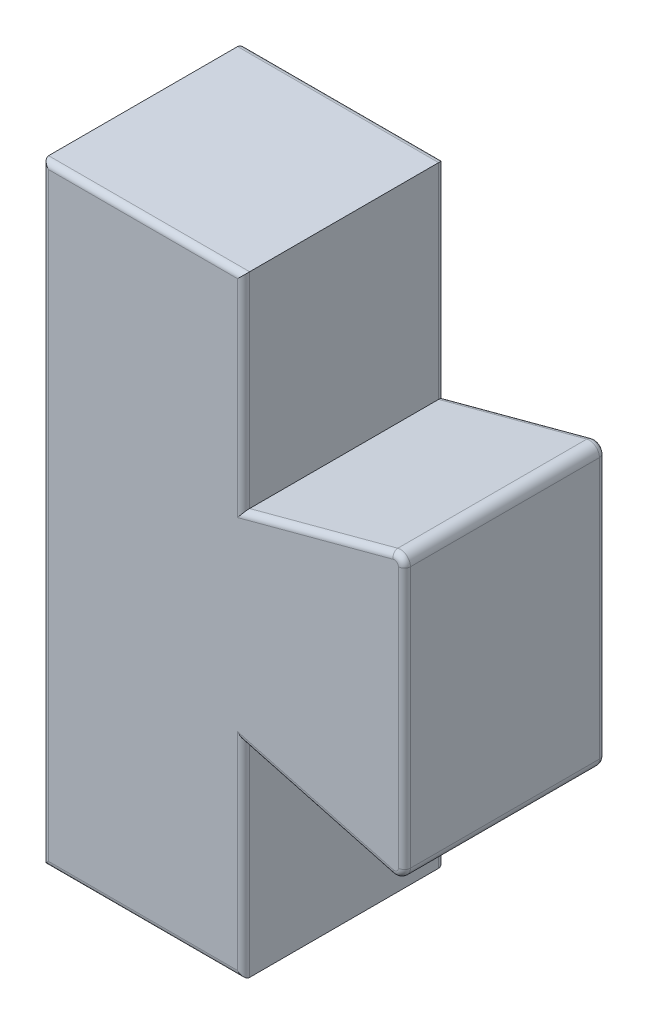
ISO-10303-21;
HEADER;
FILE_DESCRIPTION(('STEP AP214'),'2;1');
FILE_NAME('part.step','',(''),(''),'','','');
FILE_SCHEMA(('AUTOMOTIVE_DESIGN { 1 0 10303 214 1 1 1 1 }'));
ENDSEC;
DATA;
#1=APPLICATION_CONTEXT('core data for automotive mechanical design processes');
#2=APPLICATION_PROTOCOL_DEFINITION('international standard','automotive_design',2000,#1);
#3=PRODUCT_CONTEXT('',#1,'mechanical');
#4=PRODUCT('Part','Part','',(#3));
#5=PRODUCT_RELATED_PRODUCT_CATEGORY('part','',(#4));
#6=PRODUCT_DEFINITION_FORMATION('','',#4);
#7=PRODUCT_DEFINITION_CONTEXT('part definition',#1,'design');
#8=PRODUCT_DEFINITION('design','',#6,#7);
#9=PRODUCT_DEFINITION_SHAPE('','',#8);
#10=(LENGTH_UNIT() NAMED_UNIT(*) SI_UNIT(.MILLI.,.METRE.));
#11=(NAMED_UNIT(*) PLANE_ANGLE_UNIT() SI_UNIT($,.RADIAN.));
#12=(NAMED_UNIT(*) SI_UNIT($,.STERADIAN.) SOLID_ANGLE_UNIT());
#13=UNCERTAINTY_MEASURE_WITH_UNIT(LENGTH_MEASURE(1.E-05),#10,'distance_accuracy_value','');
#14=(GEOMETRIC_REPRESENTATION_CONTEXT(3) GLOBAL_UNCERTAINTY_ASSIGNED_CONTEXT((#13)) GLOBAL_UNIT_ASSIGNED_CONTEXT((#10,
#11,#12)) REPRESENTATION_CONTEXT('',''));
#15=CARTESIAN_POINT('',(0.,0.,0.));
#16=DIRECTION('',(0.,0.,1.));
#17=DIRECTION('',(1.,0.,0.));
#18=AXIS2_PLACEMENT_3D('',#15,#16,#17);
#19=CARTESIAN_POINT('',(0.,0.,10.));
#20=DIRECTION('',(0.,0.,-1.));
#21=DIRECTION('',(-1.,0.,0.));
#22=AXIS2_PLACEMENT_3D('',#19,#20,#21);
#23=PLANE('',#22);
#24=CARTESIAN_POINT('',(17.5,21.6919808530284,10.));
#25=DIRECTION('',(0.,0.,-1.));
#26=DIRECTION('',(-1.,0.,0.));
#27=AXIS2_PLACEMENT_3D('',#24,#25,#26);
#28=CIRCLE('',#27,0.2);
#29=CARTESIAN_POINT('',(17.4482361909795,21.8851660182862,10.));
#30=VERTEX_POINT('',#29);
#31=CARTESIAN_POINT('',(17.7,21.6919808530284,10.));
#32=VERTEX_POINT('',#31);
#33=EDGE_CURVE('E329',#30,#32,#28,.T.);
#34=ORIENTED_EDGE('',*,*,#33,.F.);
#35=DIRECTION('',(-0.965925826289069,-0.258819045102519,0.));
#36=VECTOR('',#35,1.);
#37=CARTESIAN_POINT('',(-4.30248130539141,16.0570788303361,10.));
#38=LINE('',#37,#36);
#39=CARTESIAN_POINT('',(9.7,19.8090323881476,10.));
#40=VERTEX_POINT('',#39);
#41=EDGE_CURVE('E282',#30,#40,#38,.T.);
#42=ORIENTED_EDGE('',*,*,#41,.T.);
#43=DIRECTION('',(0.,1.,0.));
#44=VECTOR('',#43,1.);
#45=CARTESIAN_POINT('',(9.7,0.,10.));
#46=LINE('',#45,#44);
#47=CARTESIAN_POINT('',(9.7,30.1,10.));
#48=VERTEX_POINT('',#47);
#49=EDGE_CURVE('E284',#40,#48,#46,.T.);
#50=ORIENTED_EDGE('',*,*,#49,.T.);
#51=DIRECTION('',(-1.,0.,0.));
#52=VECTOR('',#51,1.);
#53=CARTESIAN_POINT('',(0.,30.1,10.));
#54=LINE('',#53,#52);
#55=CARTESIAN_POINT('',(0.3,30.1,10.));
#56=VERTEX_POINT('',#55);
#57=EDGE_CURVE('E286',#48,#56,#54,.T.);
#58=ORIENTED_EDGE('',*,*,#57,.T.);
#59=DIRECTION('',(0.,-1.,0.));
#60=VECTOR('',#59,1.);
#61=CARTESIAN_POINT('',(0.3,0.,10.));
#62=LINE('',#61,#60);
#63=CARTESIAN_POINT('',(0.3,0.3,10.));
#64=VERTEX_POINT('',#63);
#65=EDGE_CURVE('E271',#56,#64,#62,.T.);
#66=ORIENTED_EDGE('',*,*,#65,.T.);
#67=DIRECTION('',(1.,0.,0.));
#68=VECTOR('',#67,1.);
#69=CARTESIAN_POINT('',(0.,0.3,10.));
#70=LINE('',#69,#68);
#71=CARTESIAN_POINT('',(9.70000000000002,0.3,10.));
#72=VERTEX_POINT('',#71);
#73=EDGE_CURVE('E273',#64,#72,#70,.T.);
#74=ORIENTED_EDGE('',*,*,#73,.T.);
#75=DIRECTION('',(0.,1.,0.));
#76=VECTOR('',#75,1.);
#77=CARTESIAN_POINT('',(9.70000000000002,0.,10.));
#78=LINE('',#77,#76);
#79=CARTESIAN_POINT('',(9.7,10.5909676118524,10.));
#80=VERTEX_POINT('',#79);
#81=EDGE_CURVE('E210',#72,#80,#78,.T.);
#82=ORIENTED_EDGE('',*,*,#81,.T.);
#83=DIRECTION('',(0.965925826289069,-0.258819045102517,0.));
#84=VECTOR('',#83,1.);
#85=CARTESIAN_POINT('',(3.29751869460851,12.3065073071873,10.));
#86=LINE('',#85,#84);
#87=CARTESIAN_POINT('',(17.4482361909795,8.51483398171383,10.));
#88=VERTEX_POINT('',#87);
#89=EDGE_CURVE('E276',#80,#88,#86,.T.);
#90=ORIENTED_EDGE('',*,*,#89,.T.);
#91=CARTESIAN_POINT('',(17.5,8.70801914697165,10.));
#92=DIRECTION('',(0.,0.,-1.));
#93=DIRECTION('',(-1.,0.,0.));
#94=AXIS2_PLACEMENT_3D('',#91,#92,#93);
#95=CIRCLE('',#94,0.2);
#96=CARTESIAN_POINT('',(17.7,8.70801914697165,10.));
#97=VERTEX_POINT('',#96);
#98=EDGE_CURVE('E326',#97,#88,#95,.T.);
#99=ORIENTED_EDGE('',*,*,#98,.F.);
#100=DIRECTION('',(0.,1.,0.));
#101=VECTOR('',#100,1.);
#102=CARTESIAN_POINT('',(17.7,0.,10.));
#103=LINE('',#102,#101);
#104=EDGE_CURVE('E279',#97,#32,#103,.T.);
#105=ORIENTED_EDGE('',*,*,#104,.T.);
#106=EDGE_LOOP('',(#34,#42,#50,#58,#66,#74,#82,#90,#99,#105));
#107=FACE_BOUND('',#106,.T.);
#108=ADVANCED_FACE('F39',(#107),#23,.F.);
#109=CARTESIAN_POINT('',(0.,0.,0.));
#110=DIRECTION('',(0.,0.,-1.));
#111=DIRECTION('',(-1.,0.,0.));
#112=AXIS2_PLACEMENT_3D('',#109,#110,#111);
#113=PLANE('',#112);
#114=CARTESIAN_POINT('',(17.5,21.6919808530284,0.));
#115=DIRECTION('',(0.,0.,-1.));
#116=DIRECTION('',(-1.,0.,0.));
#117=AXIS2_PLACEMENT_3D('',#114,#115,#116);
#118=CIRCLE('',#117,0.2);
#119=CARTESIAN_POINT('',(17.7,21.6919808530284,0.));
#120=VERTEX_POINT('',#119);
#121=CARTESIAN_POINT('',(17.4482361909795,21.8851660182862,0.));
#122=VERTEX_POINT('',#121);
#123=EDGE_CURVE('E320',#120,#122,#118,.F.);
#124=ORIENTED_EDGE('',*,*,#123,.F.);
#125=DIRECTION('',(0.,1.,0.));
#126=VECTOR('',#125,1.);
#127=CARTESIAN_POINT('',(17.7,8.05640646055104,0.));
#128=LINE('',#127,#126);
#129=CARTESIAN_POINT('',(17.7,8.70801914697165,0.));
#130=VERTEX_POINT('',#129);
#131=EDGE_CURVE('E234',#120,#130,#128,.F.);
#132=ORIENTED_EDGE('',*,*,#131,.T.);
#133=CARTESIAN_POINT('',(17.5,8.70801914697165,0.));
#134=DIRECTION('',(0.,0.,-1.));
#135=DIRECTION('',(-1.,0.,0.));
#136=AXIS2_PLACEMENT_3D('',#133,#134,#135);
#137=CIRCLE('',#136,0.2);
#138=CARTESIAN_POINT('',(17.4482361909795,8.51483398171383,0.));
#139=VERTEX_POINT('',#138);
#140=EDGE_CURVE('E318',#139,#130,#137,.F.);
#141=ORIENTED_EDGE('',*,*,#140,.F.);
#142=DIRECTION('',(0.965925826289069,-0.258819045102517,0.));
#143=VECTOR('',#142,1.);
#144=CARTESIAN_POINT('',(10.0776457135308,10.4897777478867,0.));
#145=LINE('',#144,#143);
#146=CARTESIAN_POINT('',(9.7,10.5909676118524,0.));
#147=VERTEX_POINT('',#146);
#148=EDGE_CURVE('E237',#139,#147,#145,.F.);
#149=ORIENTED_EDGE('',*,*,#148,.T.);
#150=DIRECTION('',(0.,1.,0.));
#151=VECTOR('',#150,1.);
#152=CARTESIAN_POINT('',(9.70000000000002,0.,0.));
#153=LINE('',#152,#151);
#154=CARTESIAN_POINT('',(9.70000000000002,0.3,0.));
#155=VERTEX_POINT('',#154);
#156=EDGE_CURVE('E239',#147,#155,#153,.F.);
#157=ORIENTED_EDGE('',*,*,#156,.T.);
#158=DIRECTION('',(1.,0.,0.));
#159=VECTOR('',#158,1.);
#160=CARTESIAN_POINT('',(0.,0.3,0.));
#161=LINE('',#160,#159);
#162=CARTESIAN_POINT('',(0.3,0.3,0.));
#163=VERTEX_POINT('',#162);
#164=EDGE_CURVE('E193',#155,#163,#161,.F.);
#165=ORIENTED_EDGE('',*,*,#164,.T.);
#166=DIRECTION('',(0.,-1.,0.));
#167=VECTOR('',#166,1.);
#168=CARTESIAN_POINT('',(0.3,30.4,0.));
#169=LINE('',#168,#167);
#170=CARTESIAN_POINT('',(0.3,30.1,0.));
#171=VERTEX_POINT('',#170);
#172=EDGE_CURVE('E222',#163,#171,#169,.F.);
#173=ORIENTED_EDGE('',*,*,#172,.T.);
#174=DIRECTION('',(-1.,0.,0.));
#175=VECTOR('',#174,1.);
#176=CARTESIAN_POINT('',(10.,30.1,0.));
#177=LINE('',#176,#175);
#178=CARTESIAN_POINT('',(9.7,30.1,0.));
#179=VERTEX_POINT('',#178);
#180=EDGE_CURVE('E227',#171,#179,#177,.F.);
#181=ORIENTED_EDGE('',*,*,#180,.T.);
#182=DIRECTION('',(0.,1.,0.));
#183=VECTOR('',#182,1.);
#184=CARTESIAN_POINT('',(9.7,20.2,0.));
#185=LINE('',#184,#183);
#186=CARTESIAN_POINT('',(9.7,19.8090323881476,0.));
#187=VERTEX_POINT('',#186);
#188=EDGE_CURVE('E229',#179,#187,#185,.F.);
#189=ORIENTED_EDGE('',*,*,#188,.T.);
#190=DIRECTION('',(-0.965925826289069,-0.258819045102519,0.));
#191=VECTOR('',#190,1.);
#192=CARTESIAN_POINT('',(18.0776457135308,22.0538157915622,0.));
#193=LINE('',#192,#191);
#194=EDGE_CURVE('E231',#187,#122,#193,.F.);
#195=ORIENTED_EDGE('',*,*,#194,.T.);
#196=EDGE_LOOP('',(#124,#132,#141,#149,#157,#165,#173,#181,#189,#195));
#197=FACE_BOUND('',#196,.T.);
#198=ADVANCED_FACE('F438',(#197),#113,.T.);
#199=CARTESIAN_POINT('',(0.,0.,10.));
#200=DIRECTION('',(1.,0.,0.));
#201=DIRECTION('',(0.,0.,-1.));
#202=AXIS2_PLACEMENT_3D('',#199,#200,#201);
#203=PLANE('',#202);
#204=DIRECTION('',(0.,0.,-1.));
#205=VECTOR('',#204,1.);
#206=CARTESIAN_POINT('',(0.,30.4,10.));
#207=LINE('',#206,#205);
#208=CARTESIAN_POINT('',(0.,30.4,9.7));
#209=VERTEX_POINT('',#208);
#210=CARTESIAN_POINT('',(0.,30.4,0.3));
#211=VERTEX_POINT('',#210);
#212=EDGE_CURVE('E306',#209,#211,#207,.T.);
#213=ORIENTED_EDGE('',*,*,#212,.T.);
#214=DIRECTION('',(0.,-1.,0.));
#215=VECTOR('',#214,1.);
#216=CARTESIAN_POINT('',(0.,0.,0.3));
#217=LINE('',#216,#215);
#218=CARTESIAN_POINT('',(0.,0.,0.3));
#219=VERTEX_POINT('',#218);
#220=EDGE_CURVE('E269',#211,#219,#217,.T.);
#221=ORIENTED_EDGE('',*,*,#220,.T.);
#222=DIRECTION('',(0.,0.,-1.));
#223=VECTOR('',#222,1.);
#224=CARTESIAN_POINT('',(0.,0.,10.));
#225=LINE('',#224,#223);
#226=CARTESIAN_POINT('',(0.,0.,9.7));
#227=VERTEX_POINT('',#226);
#228=EDGE_CURVE('E204',#227,#219,#225,.T.);
#229=ORIENTED_EDGE('',*,*,#228,.F.);
#230=DIRECTION('',(0.,-1.,0.));
#231=VECTOR('',#230,1.);
#232=CARTESIAN_POINT('',(0.,0.,9.7));
#233=LINE('',#232,#231);
#234=EDGE_CURVE('E267',#227,#209,#233,.F.);
#235=ORIENTED_EDGE('',*,*,#234,.T.);
#236=EDGE_LOOP('',(#213,#221,#229,#235));
#237=FACE_BOUND('',#236,.T.);
#238=ADVANCED_FACE('F377',(#237),#203,.F.);
#239=CARTESIAN_POINT('',(0.,0.,10.));
#240=DIRECTION('',(0.,1.,0.));
#241=DIRECTION('',(0.,0.,1.));
#242=AXIS2_PLACEMENT_3D('',#239,#240,#241);
#243=PLANE('',#242);
#244=ORIENTED_EDGE('',*,*,#228,.T.);
#245=DIRECTION('',(1.,0.,0.));
#246=VECTOR('',#245,1.);
#247=CARTESIAN_POINT('',(10.,0.,0.3));
#248=LINE('',#247,#246);
#249=CARTESIAN_POINT('',(10.,0.,0.3));
#250=VERTEX_POINT('',#249);
#251=EDGE_CURVE('E203',#219,#250,#248,.T.);
#252=ORIENTED_EDGE('',*,*,#251,.T.);
#253=DIRECTION('',(0.,0.,-1.));
#254=VECTOR('',#253,1.);
#255=CARTESIAN_POINT('',(10.,0.,10.));
#256=LINE('',#255,#254);
#257=CARTESIAN_POINT('',(10.,0.,9.7));
#258=VERTEX_POINT('',#257);
#259=EDGE_CURVE('E185',#258,#250,#256,.T.);
#260=ORIENTED_EDGE('',*,*,#259,.F.);
#261=DIRECTION('',(1.,0.,0.));
#262=VECTOR('',#261,1.);
#263=CARTESIAN_POINT('',(0.,0.,9.7));
#264=LINE('',#263,#262);
#265=EDGE_CURVE('E200',#258,#227,#264,.F.);
#266=ORIENTED_EDGE('',*,*,#265,.T.);
#267=EDGE_LOOP('',(#244,#252,#260,#266));
#268=FACE_BOUND('',#267,.T.);
#269=ADVANCED_FACE('F198',(#268),#243,.F.);
#270=CARTESIAN_POINT('',(10.,0.,10.));
#271=DIRECTION('',(-1.,0.,0.));
#272=DIRECTION('',(0.,-1.,0.));
#273=AXIS2_PLACEMENT_3D('',#270,#271,#272);
#274=PLANE('',#273);
#275=ORIENTED_EDGE('',*,*,#259,.T.);
#276=DIRECTION('',(0.,1.,0.));
#277=VECTOR('',#276,1.);
#278=CARTESIAN_POINT('',(10.,10.2,0.3));
#279=LINE('',#278,#277);
#280=CARTESIAN_POINT('',(10.,10.2,0.3));
#281=VERTEX_POINT('',#280);
#282=EDGE_CURVE('E192',#250,#281,#279,.T.);
#283=ORIENTED_EDGE('',*,*,#282,.T.);
#284=DIRECTION('',(0.,0.,-1.));
#285=VECTOR('',#284,1.);
#286=CARTESIAN_POINT('',(10.,10.2,10.));
#287=LINE('',#286,#285);
#288=CARTESIAN_POINT('',(10.,10.2,9.7));
#289=VERTEX_POINT('',#288);
#290=EDGE_CURVE('E187',#289,#281,#287,.T.);
#291=ORIENTED_EDGE('',*,*,#290,.F.);
#292=DIRECTION('',(0.,1.,0.));
#293=VECTOR('',#292,1.);
#294=CARTESIAN_POINT('',(10.,0.,9.7));
#295=LINE('',#294,#293);
#296=EDGE_CURVE('E182',#289,#258,#295,.F.);
#297=ORIENTED_EDGE('',*,*,#296,.T.);
#298=EDGE_LOOP('',(#275,#283,#291,#297));
#299=FACE_BOUND('',#298,.T.);
#300=ADVANCED_FACE('F184',(#299),#274,.F.);
#301=CARTESIAN_POINT('',(18.,8.05640646055104,10.));
#302=DIRECTION('',(0.258819045102517,0.965925826289069,0.));
#303=DIRECTION('',(-0.965925826289069,0.258819045102517,0.));
#304=AXIS2_PLACEMENT_3D('',#301,#302,#303);
#305=PLANE('',#304);
#306=DIRECTION('',(0.965925826289069,-0.258819045102517,0.));
#307=VECTOR('',#306,1.);
#308=CARTESIAN_POINT('',(18.,8.05640646055104,0.3));
#309=LINE('',#308,#307);
#310=CARTESIAN_POINT('',(17.3705904774487,8.22505623382711,0.3));
#311=VERTEX_POINT('',#310);
#312=EDGE_CURVE('E246',#281,#311,#309,.T.);
#313=ORIENTED_EDGE('',*,*,#312,.T.);
#314=DIRECTION('',(0.,0.,-1.));
#315=VECTOR('',#314,1.);
#316=CARTESIAN_POINT('',(17.3705904774487,8.22505623382711,10.));
#317=LINE('',#316,#315);
#318=CARTESIAN_POINT('',(17.3705904774487,8.22505623382711,9.7));
#319=VERTEX_POINT('',#318);
#320=EDGE_CURVE('E48',#311,#319,#317,.F.);
#321=ORIENTED_EDGE('',*,*,#320,.T.);
#322=DIRECTION('',(0.965925826289069,-0.258819045102517,0.));
#323=VECTOR('',#322,1.);
#324=CARTESIAN_POINT('',(18.,8.05640646055104,9.7));
#325=LINE('',#324,#323);
#326=EDGE_CURVE('E244',#319,#289,#325,.F.);
#327=ORIENTED_EDGE('',*,*,#326,.T.);
#328=ORIENTED_EDGE('',*,*,#290,.T.);
#329=EDGE_LOOP('',(#313,#321,#327,#328));
#330=FACE_BOUND('',#329,.T.);
#331=ADVANCED_FACE('F428',(#330),#305,.F.);
#332=CARTESIAN_POINT('',(18.,22.343593539449,10.));
#333=DIRECTION('',(-1.,0.,0.));
#334=DIRECTION('',(0.,0.,1.));
#335=AXIS2_PLACEMENT_3D('',#332,#333,#334);
#336=PLANE('',#335);
#337=DIRECTION('',(0.,1.,0.));
#338=VECTOR('',#337,1.);
#339=CARTESIAN_POINT('',(18.,22.343593539449,9.7));
#340=LINE('',#339,#338);
#341=CARTESIAN_POINT('',(18.,21.6919808530284,9.7));
#342=VERTEX_POINT('',#341);
#343=CARTESIAN_POINT('',(18.,8.70801914697165,9.7));
#344=VERTEX_POINT('',#343);
#345=EDGE_CURVE('E248',#342,#344,#340,.F.);
#346=ORIENTED_EDGE('',*,*,#345,.T.);
#347=DIRECTION('',(0.,0.,-1.));
#348=VECTOR('',#347,1.);
#349=CARTESIAN_POINT('',(18.,8.70801914697165,10.));
#350=LINE('',#349,#348);
#351=CARTESIAN_POINT('',(18.,8.70801914697165,0.3));
#352=VERTEX_POINT('',#351);
#353=EDGE_CURVE('E343',#344,#352,#350,.T.);
#354=ORIENTED_EDGE('',*,*,#353,.T.);
#355=DIRECTION('',(0.,1.,0.));
#356=VECTOR('',#355,1.);
#357=CARTESIAN_POINT('',(18.,22.343593539449,0.3));
#358=LINE('',#357,#356);
#359=CARTESIAN_POINT('',(18.,21.6919808530284,0.3));
#360=VERTEX_POINT('',#359);
#361=EDGE_CURVE('E251',#352,#360,#358,.T.);
#362=ORIENTED_EDGE('',*,*,#361,.T.);
#363=DIRECTION('',(0.,0.,-1.));
#364=VECTOR('',#363,1.);
#365=CARTESIAN_POINT('',(18.,21.6919808530284,10.));
#366=LINE('',#365,#364);
#367=EDGE_CURVE('E341',#360,#342,#366,.F.);
#368=ORIENTED_EDGE('',*,*,#367,.T.);
#369=EDGE_LOOP('',(#346,#354,#362,#368));
#370=FACE_BOUND('',#369,.T.);
#371=ADVANCED_FACE('F472',(#370),#336,.F.);
#372=CARTESIAN_POINT('',(10.,20.2,10.));
#373=DIRECTION('',(0.258819045102519,-0.965925826289069,0.));
#374=DIRECTION('',(0.965925826289069,0.258819045102519,0.));
#375=AXIS2_PLACEMENT_3D('',#372,#373,#374);
#376=PLANE('',#375);
#377=DIRECTION('',(-0.965925826289069,-0.258819045102519,0.));
#378=VECTOR('',#377,1.);
#379=CARTESIAN_POINT('',(10.,20.2,9.7));
#380=LINE('',#379,#378);
#381=CARTESIAN_POINT('',(10.,20.2,9.7));
#382=VERTEX_POINT('',#381);
#383=CARTESIAN_POINT('',(17.3705904774487,22.1749437661729,9.7));
#384=VERTEX_POINT('',#383);
#385=EDGE_CURVE('E254',#382,#384,#380,.F.);
#386=ORIENTED_EDGE('',*,*,#385,.T.);
#387=DIRECTION('',(0.,0.,-1.));
#388=VECTOR('',#387,1.);
#389=CARTESIAN_POINT('',(17.3705904774487,22.1749437661729,10.));
#390=LINE('',#389,#388);
#391=CARTESIAN_POINT('',(17.3705904774487,22.1749437661729,0.3));
#392=VERTEX_POINT('',#391);
#393=EDGE_CURVE('E11',#384,#392,#390,.T.);
#394=ORIENTED_EDGE('',*,*,#393,.T.);
#395=DIRECTION('',(-0.965925826289069,-0.258819045102519,0.));
#396=VECTOR('',#395,1.);
#397=CARTESIAN_POINT('',(10.,20.2,0.3));
#398=LINE('',#397,#396);
#399=CARTESIAN_POINT('',(10.,20.2,0.3));
#400=VERTEX_POINT('',#399);
#401=EDGE_CURVE('E256',#392,#400,#398,.T.);
#402=ORIENTED_EDGE('',*,*,#401,.T.);
#403=DIRECTION('',(0.,0.,-1.));
#404=VECTOR('',#403,1.);
#405=CARTESIAN_POINT('',(10.,20.2,10.));
#406=LINE('',#405,#404);
#407=EDGE_CURVE('E400',#382,#400,#406,.T.);
#408=ORIENTED_EDGE('',*,*,#407,.F.);
#409=EDGE_LOOP('',(#386,#394,#402,#408));
#410=FACE_BOUND('',#409,.T.);
#411=ADVANCED_FACE('F403',(#410),#376,.F.);
#412=CARTESIAN_POINT('',(10.,20.2,10.));
#413=DIRECTION('',(-1.,0.,0.));
#414=DIRECTION('',(0.,-1.,0.));
#415=AXIS2_PLACEMENT_3D('',#412,#413,#414);
#416=PLANE('',#415);
#417=ORIENTED_EDGE('',*,*,#407,.T.);
#418=DIRECTION('',(0.,1.,0.));
#419=VECTOR('',#418,1.);
#420=CARTESIAN_POINT('',(10.,30.4,0.3));
#421=LINE('',#420,#419);
#422=CARTESIAN_POINT('',(10.,30.4,0.3));
#423=VERTEX_POINT('',#422);
#424=EDGE_CURVE('E260',#400,#423,#421,.T.);
#425=ORIENTED_EDGE('',*,*,#424,.T.);
#426=DIRECTION('',(0.,0.,-1.));
#427=VECTOR('',#426,1.);
#428=CARTESIAN_POINT('',(10.,30.4,10.));
#429=LINE('',#428,#427);
#430=CARTESIAN_POINT('',(10.,30.4,9.7));
#431=VERTEX_POINT('',#430);
#432=EDGE_CURVE('E385',#431,#423,#429,.T.);
#433=ORIENTED_EDGE('',*,*,#432,.F.);
#434=DIRECTION('',(0.,1.,0.));
#435=VECTOR('',#434,1.);
#436=CARTESIAN_POINT('',(10.,20.2,9.7));
#437=LINE('',#436,#435);
#438=EDGE_CURVE('E258',#431,#382,#437,.F.);
#439=ORIENTED_EDGE('',*,*,#438,.T.);
#440=EDGE_LOOP('',(#417,#425,#433,#439));
#441=FACE_BOUND('',#440,.T.);
#442=ADVANCED_FACE('F399',(#441),#416,.F.);
#443=CARTESIAN_POINT('',(0.,30.4,10.));
#444=DIRECTION('',(0.,-1.,0.));
#445=DIRECTION('',(0.,0.,-1.));
#446=AXIS2_PLACEMENT_3D('',#443,#444,#445);
#447=PLANE('',#446);
#448=ORIENTED_EDGE('',*,*,#432,.T.);
#449=DIRECTION('',(-1.,0.,0.));
#450=VECTOR('',#449,1.);
#451=CARTESIAN_POINT('',(0.,30.4,0.3));
#452=LINE('',#451,#450);
#453=EDGE_CURVE('E265',#423,#211,#452,.T.);
#454=ORIENTED_EDGE('',*,*,#453,.T.);
#455=ORIENTED_EDGE('',*,*,#212,.F.);
#456=DIRECTION('',(-1.,0.,0.));
#457=VECTOR('',#456,1.);
#458=CARTESIAN_POINT('',(0.,30.4,9.7));
#459=LINE('',#458,#457);
#460=EDGE_CURVE('E262',#209,#431,#459,.F.);
#461=ORIENTED_EDGE('',*,*,#460,.T.);
#462=EDGE_LOOP('',(#448,#454,#455,#461));
#463=FACE_BOUND('',#462,.T.);
#464=ADVANCED_FACE('F382',(#463),#447,.F.);
#465=CARTESIAN_POINT('',(10.0776457135308,19.9102222521133,0.3));
#466=DIRECTION('',(0.965925826289069,0.258819045102519,0.));
#467=DIRECTION('',(-0.258819045102519,0.965925826289069,0.));
#468=AXIS2_PLACEMENT_3D('',#465,#466,#467);
#469=CYLINDRICAL_SURFACE('',#468,0.3);
#470=ORIENTED_EDGE('',*,*,#401,.F.);
#471=CARTESIAN_POINT('',(17.4482361909795,21.8851660182862,0.3));
#472=DIRECTION('',(-0.965925826289068,-0.258819045102523,0.));
#473=DIRECTION('',(0.258819045102523,-0.965925826289068,0.));
#474=AXIS2_PLACEMENT_3D('',#471,#472,#473);
#475=CIRCLE('',#474,0.3);
#476=EDGE_CURVE('E289',#392,#122,#475,.T.);
#477=ORIENTED_EDGE('',*,*,#476,.T.);
#478=ORIENTED_EDGE('',*,*,#194,.F.);
#479=CARTESIAN_POINT('',(9.7,19.8090323881476,0.3));
#480=DIRECTION('',(0.793353340291235,-0.608761429008721,0.));
#481=DIRECTION('',(0.608761429008721,0.793353340291234,0.));
#482=AXIS2_PLACEMENT_3D('',#479,#480,#481);
#483=ELLIPSE('',#482,0.492803889511374,0.3);
#484=EDGE_CURVE('E303',#400,#187,#483,.F.);
#485=ORIENTED_EDGE('',*,*,#484,.F.);
#486=EDGE_LOOP('',(#470,#477,#478,#485));
#487=FACE_BOUND('',#486,.T.);
#488=ADVANCED_FACE('F418',(#487),#469,.T.);
#489=CARTESIAN_POINT('',(9.7,20.2,0.3));
#490=DIRECTION('',(0.,-1.,0.));
#491=DIRECTION('',(1.,0.,0.));
#492=AXIS2_PLACEMENT_3D('',#489,#490,#491);
#493=CYLINDRICAL_SURFACE('',#492,0.3);
#494=ORIENTED_EDGE('',*,*,#484,.T.);
#495=ORIENTED_EDGE('',*,*,#188,.F.);
#496=CARTESIAN_POINT('',(9.7,30.1,0.3));
#497=DIRECTION('',(0.707106781186548,-0.707106781186547,0.));
#498=DIRECTION('',(0.707106781186547,0.707106781186548,0.));
#499=AXIS2_PLACEMENT_3D('',#496,#497,#498);
#500=ELLIPSE('',#499,0.424264068711928,0.3);
#501=EDGE_CURVE('E300',#423,#179,#500,.F.);
#502=ORIENTED_EDGE('',*,*,#501,.F.);
#503=ORIENTED_EDGE('',*,*,#424,.F.);
#504=EDGE_LOOP('',(#494,#495,#502,#503));
#505=FACE_BOUND('',#504,.T.);
#506=ADVANCED_FACE('F424',(#505),#493,.T.);
#507=CARTESIAN_POINT('',(17.7,22.343593539449,0.3));
#508=DIRECTION('',(0.,-1.,0.));
#509=DIRECTION('',(0.,0.,-1.));
#510=AXIS2_PLACEMENT_3D('',#507,#508,#509);
#511=CYLINDRICAL_SURFACE('',#510,0.3);
#512=ORIENTED_EDGE('',*,*,#361,.F.);
#513=CARTESIAN_POINT('',(17.7,8.70801914697165,0.3));
#514=DIRECTION('',(0.,1.,0.));
#515=DIRECTION('',(0.,0.,1.));
#516=AXIS2_PLACEMENT_3D('',#513,#514,#515);
#517=CIRCLE('',#516,0.3);
#518=EDGE_CURVE('E334',#352,#130,#517,.T.);
#519=ORIENTED_EDGE('',*,*,#518,.T.);
#520=ORIENTED_EDGE('',*,*,#131,.F.);
#521=CARTESIAN_POINT('',(17.7,21.6919808530284,0.3));
#522=DIRECTION('',(0.,-1.,0.));
#523=DIRECTION('',(0.,0.,-1.));
#524=AXIS2_PLACEMENT_3D('',#521,#522,#523);
#525=CIRCLE('',#524,0.3);
#526=EDGE_CURVE('E332',#120,#360,#525,.T.);
#527=ORIENTED_EDGE('',*,*,#526,.T.);
#528=EDGE_LOOP('',(#512,#519,#520,#527));
#529=FACE_BOUND('',#528,.T.);
#530=ADVANCED_FACE('F450',(#529),#511,.T.);
#531=CARTESIAN_POINT('',(0.,30.1,0.3));
#532=DIRECTION('',(1.,0.,0.));
#533=DIRECTION('',(0.,0.,-1.));
#534=AXIS2_PLACEMENT_3D('',#531,#532,#533);
#535=CYLINDRICAL_SURFACE('',#534,0.3);
#536=ORIENTED_EDGE('',*,*,#501,.T.);
#537=ORIENTED_EDGE('',*,*,#180,.F.);
#538=CARTESIAN_POINT('',(0.3,30.1,0.3));
#539=DIRECTION('',(0.707106781186547,0.707106781186547,0.));
#540=DIRECTION('',(-0.707106781186547,0.707106781186547,0.));
#541=AXIS2_PLACEMENT_3D('',#538,#539,#540);
#542=ELLIPSE('',#541,0.424264068711928,0.3);
#543=EDGE_CURVE('E297',#211,#171,#542,.F.);
#544=ORIENTED_EDGE('',*,*,#543,.F.);
#545=ORIENTED_EDGE('',*,*,#453,.F.);
#546=EDGE_LOOP('',(#536,#537,#544,#545));
#547=FACE_BOUND('',#546,.T.);
#548=ADVANCED_FACE('F448',(#547),#535,.T.);
#549=CARTESIAN_POINT('',(18.0776457135308,8.34618420843776,0.3));
#550=DIRECTION('',(-0.965925826289069,0.258819045102517,0.));
#551=DIRECTION('',(-0.258819045102517,-0.965925826289069,0.));
#552=AXIS2_PLACEMENT_3D('',#549,#550,#551);
#553=CYLINDRICAL_SURFACE('',#552,0.3);
#554=ORIENTED_EDGE('',*,*,#148,.F.);
#555=CARTESIAN_POINT('',(17.4482361909795,8.51483398171383,0.3));
#556=DIRECTION('',(-0.965925826289068,0.258819045102521,0.));
#557=DIRECTION('',(-0.258819045102521,-0.965925826289068,0.));
#558=AXIS2_PLACEMENT_3D('',#555,#556,#557);
#559=CIRCLE('',#558,0.3);
#560=EDGE_CURVE('E64',#139,#311,#559,.T.);
#561=ORIENTED_EDGE('',*,*,#560,.T.);
#562=ORIENTED_EDGE('',*,*,#312,.F.);
#563=CARTESIAN_POINT('',(9.7,10.5909676118524,0.3));
#564=DIRECTION('',(-0.793353340291234,-0.608761429008723,0.));
#565=DIRECTION('',(0.608761429008723,-0.793353340291233,0.));
#566=AXIS2_PLACEMENT_3D('',#563,#564,#565);
#567=ELLIPSE('',#566,0.492803889511374,0.3);
#568=EDGE_CURVE('E294',#147,#281,#567,.T.);
#569=ORIENTED_EDGE('',*,*,#568,.F.);
#570=EDGE_LOOP('',(#554,#561,#562,#569));
#571=FACE_BOUND('',#570,.T.);
#572=ADVANCED_FACE('F430',(#571),#553,.T.);
#573=CARTESIAN_POINT('',(0.3,0.,0.3));
#574=DIRECTION('',(0.,1.,0.));
#575=DIRECTION('',(0.,0.,1.));
#576=AXIS2_PLACEMENT_3D('',#573,#574,#575);
#577=CYLINDRICAL_SURFACE('',#576,0.3);
#578=ORIENTED_EDGE('',*,*,#543,.T.);
#579=ORIENTED_EDGE('',*,*,#172,.F.);
#580=CARTESIAN_POINT('',(0.3,0.3,0.3));
#581=DIRECTION('',(-0.707106781186547,0.707106781186547,0.));
#582=DIRECTION('',(0.707106781186547,0.707106781186547,0.));
#583=AXIS2_PLACEMENT_3D('',#580,#581,#582);
#584=ELLIPSE('',#583,0.424264068711928,0.3);
#585=EDGE_CURVE('E292',#219,#163,#584,.F.);
#586=ORIENTED_EDGE('',*,*,#585,.F.);
#587=ORIENTED_EDGE('',*,*,#220,.F.);
#588=EDGE_LOOP('',(#578,#579,#586,#587));
#589=FACE_BOUND('',#588,.T.);
#590=ADVANCED_FACE('F445',(#589),#577,.T.);
#591=CARTESIAN_POINT('',(9.70000000000002,0.,0.3));
#592=DIRECTION('',(0.,-1.,0.));
#593=DIRECTION('',(1.,0.,0.));
#594=AXIS2_PLACEMENT_3D('',#591,#592,#593);
#595=CYLINDRICAL_SURFACE('',#594,0.3);
#596=ORIENTED_EDGE('',*,*,#568,.T.);
#597=ORIENTED_EDGE('',*,*,#282,.F.);
#598=CARTESIAN_POINT('',(9.70000000000002,0.3,0.3));
#599=DIRECTION('',(-0.707106781186547,-0.707106781186548,0.));
#600=DIRECTION('',(0.707106781186548,-0.707106781186547,0.));
#601=AXIS2_PLACEMENT_3D('',#598,#599,#600);
#602=ELLIPSE('',#601,0.424264068711929,0.3);
#603=EDGE_CURVE('E290',#155,#250,#602,.T.);
#604=ORIENTED_EDGE('',*,*,#603,.F.);
#605=ORIENTED_EDGE('',*,*,#156,.F.);
#606=EDGE_LOOP('',(#596,#597,#604,#605));
#607=FACE_BOUND('',#606,.T.);
#608=ADVANCED_FACE('F434',(#607),#595,.T.);
#609=CARTESIAN_POINT('',(0.,0.3,0.3));
#610=DIRECTION('',(-1.,0.,0.));
#611=DIRECTION('',(0.,0.,1.));
#612=AXIS2_PLACEMENT_3D('',#609,#610,#611);
#613=CYLINDRICAL_SURFACE('',#612,0.3);
#614=ORIENTED_EDGE('',*,*,#585,.T.);
#615=ORIENTED_EDGE('',*,*,#164,.F.);
#616=ORIENTED_EDGE('',*,*,#603,.T.);
#617=ORIENTED_EDGE('',*,*,#251,.F.);
#618=EDGE_LOOP('',(#614,#615,#616,#617));
#619=FACE_BOUND('',#618,.T.);
#620=ADVANCED_FACE('F440',(#619),#613,.T.);
#621=CARTESIAN_POINT('',(3.29751869460851,12.3065073071873,9.7));
#622=DIRECTION('',(0.965925826289069,-0.258819045102517,0.));
#623=DIRECTION('',(0.258819045102517,0.965925826289069,0.));
#624=AXIS2_PLACEMENT_3D('',#621,#622,#623);
#625=CYLINDRICAL_SURFACE('',#624,0.3);
#626=ORIENTED_EDGE('',*,*,#326,.F.);
#627=CARTESIAN_POINT('',(17.4482361909795,8.51483398171383,9.7));
#628=DIRECTION('',(-0.965925826289068,0.258819045102521,0.));
#629=DIRECTION('',(-0.258819045102521,-0.965925826289068,0.));
#630=AXIS2_PLACEMENT_3D('',#627,#628,#629);
#631=CIRCLE('',#630,0.3);
#632=EDGE_CURVE('E337',#319,#88,#631,.T.);
#633=ORIENTED_EDGE('',*,*,#632,.T.);
#634=ORIENTED_EDGE('',*,*,#89,.F.);
#635=CARTESIAN_POINT('',(9.7,10.5909676118524,9.7));
#636=DIRECTION('',(0.793353340291234,0.608761429008723,0.));
#637=DIRECTION('',(0.608761429008723,-0.793353340291233,0.));
#638=AXIS2_PLACEMENT_3D('',#635,#636,#637);
#639=ELLIPSE('',#638,0.492803889511374,0.3);
#640=EDGE_CURVE('E213',#289,#80,#639,.F.);
#641=ORIENTED_EDGE('',*,*,#640,.F.);
#642=EDGE_LOOP('',(#626,#633,#634,#641));
#643=FACE_BOUND('',#642,.T.);
#644=ADVANCED_FACE('F367',(#643),#625,.T.);
#645=CARTESIAN_POINT('',(17.7,0.,9.7));
#646=DIRECTION('',(0.,1.,0.));
#647=DIRECTION('',(0.,0.,1.));
#648=AXIS2_PLACEMENT_3D('',#645,#646,#647);
#649=CYLINDRICAL_SURFACE('',#648,0.3);
#650=ORIENTED_EDGE('',*,*,#345,.F.);
#651=CARTESIAN_POINT('',(17.7,21.6919808530284,9.7));
#652=DIRECTION('',(0.,-1.,0.));
#653=DIRECTION('',(0.,0.,-1.));
#654=AXIS2_PLACEMENT_3D('',#651,#652,#653);
#655=CIRCLE('',#654,0.3);
#656=EDGE_CURVE('E324',#342,#32,#655,.T.);
#657=ORIENTED_EDGE('',*,*,#656,.T.);
#658=ORIENTED_EDGE('',*,*,#104,.F.);
#659=CARTESIAN_POINT('',(17.7,8.70801914697165,9.7));
#660=DIRECTION('',(0.,1.,0.));
#661=DIRECTION('',(0.,0.,1.));
#662=AXIS2_PLACEMENT_3D('',#659,#660,#661);
#663=CIRCLE('',#662,0.3);
#664=EDGE_CURVE('E322',#97,#344,#663,.T.);
#665=ORIENTED_EDGE('',*,*,#664,.T.);
#666=EDGE_LOOP('',(#650,#657,#658,#665));
#667=FACE_BOUND('',#666,.T.);
#668=ADVANCED_FACE('F508',(#667),#649,.T.);
#669=CARTESIAN_POINT('',(9.70000000000002,0.,9.7));
#670=DIRECTION('',(0.,1.,0.));
#671=DIRECTION('',(-1.,0.,0.));
#672=AXIS2_PLACEMENT_3D('',#669,#670,#671);
#673=CYLINDRICAL_SURFACE('',#672,0.3);
#674=ORIENTED_EDGE('',*,*,#640,.T.);
#675=ORIENTED_EDGE('',*,*,#81,.F.);
#676=CARTESIAN_POINT('',(9.70000000000002,0.3,9.7));
#677=DIRECTION('',(0.707106781186547,0.707106781186548,0.));
#678=DIRECTION('',(0.707106781186548,-0.707106781186547,0.));
#679=AXIS2_PLACEMENT_3D('',#676,#677,#678);
#680=ELLIPSE('',#679,0.424264068711929,0.3);
#681=EDGE_CURVE('E208',#258,#72,#680,.F.);
#682=ORIENTED_EDGE('',*,*,#681,.F.);
#683=ORIENTED_EDGE('',*,*,#296,.F.);
#684=EDGE_LOOP('',(#674,#675,#682,#683));
#685=FACE_BOUND('',#684,.T.);
#686=ADVANCED_FACE('F209',(#685),#673,.T.);
#687=CARTESIAN_POINT('',(-4.30248130539141,16.0570788303361,9.7));
#688=DIRECTION('',(-0.965925826289069,-0.258819045102519,0.));
#689=DIRECTION('',(0.258819045102519,-0.965925826289069,0.));
#690=AXIS2_PLACEMENT_3D('',#687,#688,#689);
#691=CYLINDRICAL_SURFACE('',#690,0.3);
#692=ORIENTED_EDGE('',*,*,#41,.F.);
#693=CARTESIAN_POINT('',(17.4482361909795,21.8851660182862,9.7));
#694=DIRECTION('',(-0.965925826289068,-0.258819045102523,0.));
#695=DIRECTION('',(0.258819045102523,-0.965925826289068,0.));
#696=AXIS2_PLACEMENT_3D('',#693,#694,#695);
#697=CIRCLE('',#696,0.3);
#698=EDGE_CURVE('E56',#30,#384,#697,.T.);
#699=ORIENTED_EDGE('',*,*,#698,.T.);
#700=ORIENTED_EDGE('',*,*,#385,.F.);
#701=CARTESIAN_POINT('',(9.7,19.8090323881476,9.7));
#702=DIRECTION('',(-0.793353340291235,0.608761429008721,0.));
#703=DIRECTION('',(0.608761429008721,0.793353340291234,0.));
#704=AXIS2_PLACEMENT_3D('',#701,#702,#703);
#705=ELLIPSE('',#704,0.492803889511374,0.3);
#706=EDGE_CURVE('E214',#40,#382,#705,.T.);
#707=ORIENTED_EDGE('',*,*,#706,.F.);
#708=EDGE_LOOP('',(#692,#699,#700,#707));
#709=FACE_BOUND('',#708,.T.);
#710=ADVANCED_FACE('F407',(#709),#691,.T.);
#711=CARTESIAN_POINT('',(0.,0.3,9.7));
#712=DIRECTION('',(1.,0.,0.));
#713=DIRECTION('',(0.,0.,-1.));
#714=AXIS2_PLACEMENT_3D('',#711,#712,#713);
#715=CYLINDRICAL_SURFACE('',#714,0.3);
#716=ORIENTED_EDGE('',*,*,#681,.T.);
#717=ORIENTED_EDGE('',*,*,#73,.F.);
#718=CARTESIAN_POINT('',(0.3,0.3,9.7));
#719=DIRECTION('',(0.707106781186547,-0.707106781186547,0.));
#720=DIRECTION('',(-0.707106781186547,-0.707106781186547,0.));
#721=AXIS2_PLACEMENT_3D('',#718,#719,#720);
#722=ELLIPSE('',#721,0.424264068711928,0.3);
#723=EDGE_CURVE('E219',#227,#64,#722,.F.);
#724=ORIENTED_EDGE('',*,*,#723,.F.);
#725=ORIENTED_EDGE('',*,*,#265,.F.);
#726=EDGE_LOOP('',(#716,#717,#724,#725));
#727=FACE_BOUND('',#726,.T.);
#728=ADVANCED_FACE('F217',(#727),#715,.T.);
#729=CARTESIAN_POINT('',(9.7,0.,9.7));
#730=DIRECTION('',(0.,1.,0.));
#731=DIRECTION('',(-1.,0.,0.));
#732=AXIS2_PLACEMENT_3D('',#729,#730,#731);
#733=CYLINDRICAL_SURFACE('',#732,0.3);
#734=ORIENTED_EDGE('',*,*,#706,.T.);
#735=ORIENTED_EDGE('',*,*,#438,.F.);
#736=CARTESIAN_POINT('',(9.7,30.1,9.7));
#737=DIRECTION('',(-0.707106781186548,0.707106781186547,0.));
#738=DIRECTION('',(0.707106781186547,0.707106781186548,0.));
#739=AXIS2_PLACEMENT_3D('',#736,#737,#738);
#740=ELLIPSE('',#739,0.424264068711928,0.3);
#741=EDGE_CURVE('E309',#48,#431,#740,.T.);
#742=ORIENTED_EDGE('',*,*,#741,.F.);
#743=ORIENTED_EDGE('',*,*,#49,.F.);
#744=EDGE_LOOP('',(#734,#735,#742,#743));
#745=FACE_BOUND('',#744,.T.);
#746=ADVANCED_FACE('F394',(#745),#733,.T.);
#747=CARTESIAN_POINT('',(0.3,0.,9.7));
#748=DIRECTION('',(0.,-1.,0.));
#749=DIRECTION('',(0.,0.,-1.));
#750=AXIS2_PLACEMENT_3D('',#747,#748,#749);
#751=CYLINDRICAL_SURFACE('',#750,0.3);
#752=ORIENTED_EDGE('',*,*,#723,.T.);
#753=ORIENTED_EDGE('',*,*,#65,.F.);
#754=CARTESIAN_POINT('',(0.3,30.1,9.7));
#755=DIRECTION('',(-0.707106781186547,-0.707106781186547,0.));
#756=DIRECTION('',(0.707106781186547,-0.707106781186547,0.));
#757=AXIS2_PLACEMENT_3D('',#754,#755,#756);
#758=ELLIPSE('',#757,0.424264068711928,0.3);
#759=EDGE_CURVE('E307',#209,#56,#758,.F.);
#760=ORIENTED_EDGE('',*,*,#759,.F.);
#761=ORIENTED_EDGE('',*,*,#234,.F.);
#762=EDGE_LOOP('',(#752,#753,#760,#761));
#763=FACE_BOUND('',#762,.T.);
#764=ADVANCED_FACE('F372',(#763),#751,.T.);
#765=CARTESIAN_POINT('',(0.,30.1,9.7));
#766=DIRECTION('',(-1.,0.,0.));
#767=DIRECTION('',(0.,0.,1.));
#768=AXIS2_PLACEMENT_3D('',#765,#766,#767);
#769=CYLINDRICAL_SURFACE('',#768,0.3);
#770=ORIENTED_EDGE('',*,*,#741,.T.);
#771=ORIENTED_EDGE('',*,*,#460,.F.);
#772=ORIENTED_EDGE('',*,*,#759,.T.);
#773=ORIENTED_EDGE('',*,*,#57,.F.);
#774=EDGE_LOOP('',(#770,#771,#772,#773));
#775=FACE_BOUND('',#774,.T.);
#776=ADVANCED_FACE('F388',(#775),#769,.T.);
#777=CARTESIAN_POINT('',(17.5,21.6919808530284,9.7));
#778=DIRECTION('',(0.,0.,-1.));
#779=DIRECTION('',(-1.,0.,0.));
#780=AXIS2_PLACEMENT_3D('',#777,#778,#779);
#781=DEGENERATE_TOROIDAL_SURFACE('',#780,0.2,0.3,.T.);
#782=ORIENTED_EDGE('',*,*,#33,.T.);
#783=ORIENTED_EDGE('',*,*,#656,.F.);
#784=CARTESIAN_POINT('',(17.5,21.6919808530284,9.7));
#785=DIRECTION('',(0.,0.,-1.));
#786=DIRECTION('',(-1.,0.,0.));
#787=AXIS2_PLACEMENT_3D('',#784,#785,#786);
#788=CIRCLE('',#787,0.5);
#789=EDGE_CURVE('E310',#384,#342,#788,.T.);
#790=ORIENTED_EDGE('',*,*,#789,.F.);
#791=ORIENTED_EDGE('',*,*,#698,.F.);
#792=EDGE_LOOP('',(#782,#783,#790,#791));
#793=FACE_BOUND('',#792,.T.);
#794=ADVANCED_FACE('F410',(#793),#781,.T.);
#795=CARTESIAN_POINT('',(17.5,21.6919808530284,10.));
#796=DIRECTION('',(0.,0.,-1.));
#797=DIRECTION('',(-1.,0.,0.));
#798=AXIS2_PLACEMENT_3D('',#795,#796,#797);
#799=CYLINDRICAL_SURFACE('',#798,0.5);
#800=ORIENTED_EDGE('',*,*,#789,.T.);
#801=ORIENTED_EDGE('',*,*,#367,.F.);
#802=CARTESIAN_POINT('',(17.5,21.6919808530284,0.3));
#803=DIRECTION('',(0.,0.,-1.));
#804=DIRECTION('',(-1.,0.,0.));
#805=AXIS2_PLACEMENT_3D('',#802,#803,#804);
#806=CIRCLE('',#805,0.5);
#807=EDGE_CURVE('E346',#392,#360,#806,.T.);
#808=ORIENTED_EDGE('',*,*,#807,.F.);
#809=ORIENTED_EDGE('',*,*,#393,.F.);
#810=EDGE_LOOP('',(#800,#801,#808,#809));
#811=FACE_BOUND('',#810,.T.);
#812=ADVANCED_FACE('F415',(#811),#799,.T.);
#813=CARTESIAN_POINT('',(17.5,21.6919808530284,0.3));
#814=DIRECTION('',(0.,0.,-1.));
#815=DIRECTION('',(-1.,0.,0.));
#816=AXIS2_PLACEMENT_3D('',#813,#814,#815);
#817=DEGENERATE_TOROIDAL_SURFACE('',#816,0.2,0.3,.T.);
#818=ORIENTED_EDGE('',*,*,#476,.F.);
#819=ORIENTED_EDGE('',*,*,#807,.T.);
#820=ORIENTED_EDGE('',*,*,#526,.F.);
#821=ORIENTED_EDGE('',*,*,#123,.T.);
#822=EDGE_LOOP('',(#818,#819,#820,#821));
#823=FACE_BOUND('',#822,.T.);
#824=ADVANCED_FACE('F563',(#823),#817,.T.);
#825=CARTESIAN_POINT('',(17.5,8.70801914697165,9.7));
#826=DIRECTION('',(0.,0.,-1.));
#827=DIRECTION('',(-1.,0.,0.));
#828=AXIS2_PLACEMENT_3D('',#825,#826,#827);
#829=DEGENERATE_TOROIDAL_SURFACE('',#828,0.2,0.3,.T.);
#830=ORIENTED_EDGE('',*,*,#98,.T.);
#831=ORIENTED_EDGE('',*,*,#632,.F.);
#832=CARTESIAN_POINT('',(17.5,8.70801914697165,9.7));
#833=DIRECTION('',(0.,0.,-1.));
#834=DIRECTION('',(-1.,0.,0.));
#835=AXIS2_PLACEMENT_3D('',#832,#833,#834);
#836=CIRCLE('',#835,0.5);
#837=EDGE_CURVE('E43',#344,#319,#836,.T.);
#838=ORIENTED_EDGE('',*,*,#837,.F.);
#839=ORIENTED_EDGE('',*,*,#664,.F.);
#840=EDGE_LOOP('',(#830,#831,#838,#839));
#841=FACE_BOUND('',#840,.T.);
#842=ADVANCED_FACE('F41',(#841),#829,.T.);
#843=CARTESIAN_POINT('',(17.5,8.70801914697165,10.));
#844=DIRECTION('',(0.,0.,-1.));
#845=DIRECTION('',(-1.,0.,0.));
#846=AXIS2_PLACEMENT_3D('',#843,#844,#845);
#847=CYLINDRICAL_SURFACE('',#846,0.5);
#848=ORIENTED_EDGE('',*,*,#837,.T.);
#849=ORIENTED_EDGE('',*,*,#320,.F.);
#850=CARTESIAN_POINT('',(17.5,8.70801914697165,0.299999999999995));
#851=DIRECTION('',(0.,0.,-1.));
#852=DIRECTION('',(-1.,0.,0.));
#853=AXIS2_PLACEMENT_3D('',#850,#851,#852);
#854=CIRCLE('',#853,0.5);
#855=EDGE_CURVE('E350',#352,#311,#854,.T.);
#856=ORIENTED_EDGE('',*,*,#855,.F.);
#857=ORIENTED_EDGE('',*,*,#353,.F.);
#858=EDGE_LOOP('',(#848,#849,#856,#857));
#859=FACE_BOUND('',#858,.T.);
#860=ADVANCED_FACE('F360',(#859),#847,.T.);
#861=CARTESIAN_POINT('',(17.5,8.70801914697165,0.3));
#862=DIRECTION('',(0.,0.,-1.));
#863=DIRECTION('',(-1.,0.,0.));
#864=AXIS2_PLACEMENT_3D('',#861,#862,#863);
#865=DEGENERATE_TOROIDAL_SURFACE('',#864,0.2,0.3,.T.);
#866=ORIENTED_EDGE('',*,*,#518,.F.);
#867=ORIENTED_EDGE('',*,*,#855,.T.);
#868=ORIENTED_EDGE('',*,*,#560,.F.);
#869=ORIENTED_EDGE('',*,*,#140,.T.);
#870=EDGE_LOOP('',(#866,#867,#868,#869));
#871=FACE_BOUND('',#870,.T.);
#872=ADVANCED_FACE('F582',(#871),#865,.T.);
#873=CLOSED_SHELL('',(#108,#198,#238,#269,#300,#331,#371,#411,#442,#464,#488,#506,#530,#548,
#572,#590,#608,#620,#644,#668,#686,#710,#728,#746,#764,#776,#794,#812,#824,#842,#860,#872));
#874=MANIFOLD_SOLID_BREP('B2',#873);
#875=ADVANCED_BREP_SHAPE_REPRESENTATION('',(#18,#874),#14);
#876=SHAPE_DEFINITION_REPRESENTATION(#9,#875);
ENDSEC;
END-ISO-10303-21;
